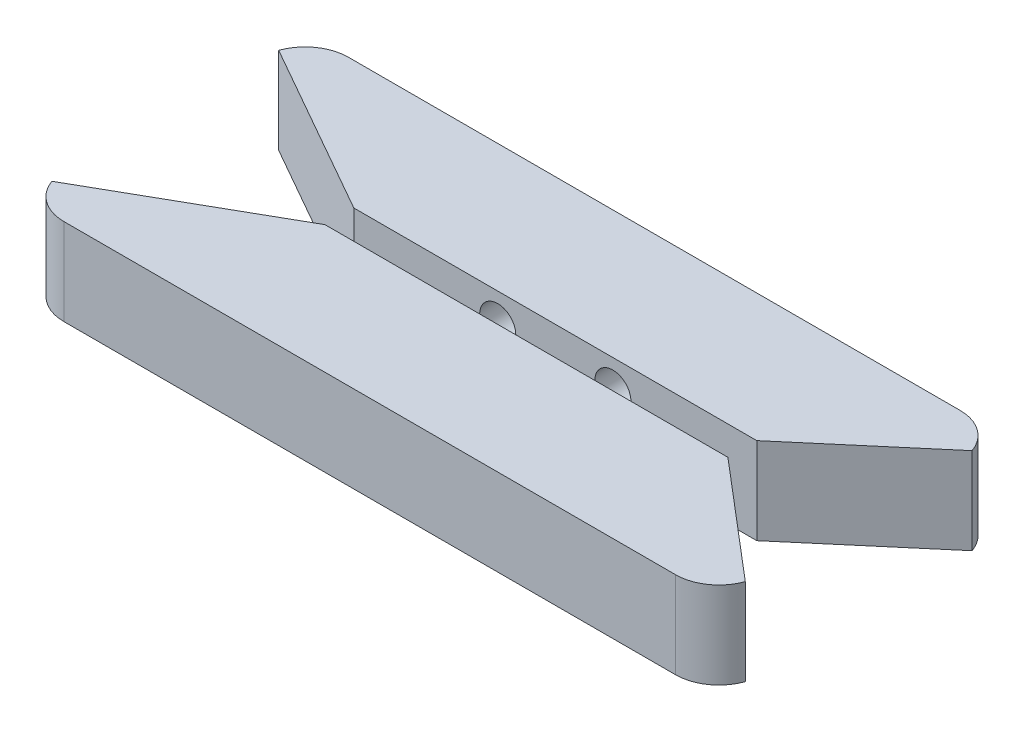
ISO-10303-21;
HEADER;
FILE_DESCRIPTION(('STEP AP214'),'2;1');
FILE_NAME('part.step','',(''),(''),'','','');
FILE_SCHEMA(('AUTOMOTIVE_DESIGN { 1 0 10303 214 1 1 1 1 }'));
ENDSEC;
DATA;
#1=APPLICATION_CONTEXT('core data for automotive mechanical design processes');
#2=APPLICATION_PROTOCOL_DEFINITION('international standard','automotive_design',2000,#1);
#3=PRODUCT_CONTEXT('',#1,'mechanical');
#4=PRODUCT('Part','Part','',(#3));
#5=PRODUCT_RELATED_PRODUCT_CATEGORY('part','',(#4));
#6=PRODUCT_DEFINITION_FORMATION('','',#4);
#7=PRODUCT_DEFINITION_CONTEXT('part definition',#1,'design');
#8=PRODUCT_DEFINITION('design','',#6,#7);
#9=PRODUCT_DEFINITION_SHAPE('','',#8);
#10=(LENGTH_UNIT() NAMED_UNIT(*) SI_UNIT(.MILLI.,.METRE.));
#11=(NAMED_UNIT(*) PLANE_ANGLE_UNIT() SI_UNIT($,.RADIAN.));
#12=(NAMED_UNIT(*) SI_UNIT($,.STERADIAN.) SOLID_ANGLE_UNIT());
#13=UNCERTAINTY_MEASURE_WITH_UNIT(LENGTH_MEASURE(1.E-05),#10,'distance_accuracy_value','');
#14=(GEOMETRIC_REPRESENTATION_CONTEXT(3) GLOBAL_UNCERTAINTY_ASSIGNED_CONTEXT((#13)) GLOBAL_UNIT_ASSIGNED_CONTEXT((#10,
#11,#12)) REPRESENTATION_CONTEXT('',''));
#15=CARTESIAN_POINT('',(0.,0.,0.));
#16=DIRECTION('',(0.,0.,1.));
#17=DIRECTION('',(1.,0.,0.));
#18=AXIS2_PLACEMENT_3D('',#15,#16,#17);
#19=CARTESIAN_POINT('',(-51.995,12.,17.7));
#20=DIRECTION('',(0.494195323295039,0.,0.869350897183244));
#21=DIRECTION('',(-0.869350897183244,0.,0.494195323295039));
#22=AXIS2_PLACEMENT_3D('',#19,#20,#21);
#23=PLANE('',#22);
#24=DIRECTION('',(0.869350897183244,0.,-0.494195323295039));
#25=VECTOR('',#24,1.);
#26=CARTESIAN_POINT('',(-51.995,0.,17.7));
#27=LINE('',#26,#25);
#28=CARTESIAN_POINT('',(-51.995,0.,17.7));
#29=VERTEX_POINT('',#28);
#30=CARTESIAN_POINT('',(-27.895,0.,4.));
#31=VERTEX_POINT('',#30);
#32=EDGE_CURVE('E112',#29,#31,#27,.T.);
#33=ORIENTED_EDGE('',*,*,#32,.F.);
#34=DIRECTION('',(0.,-1.,0.));
#35=VECTOR('',#34,1.);
#36=CARTESIAN_POINT('',(-51.995,12.,17.7));
#37=LINE('',#36,#35);
#38=CARTESIAN_POINT('',(-51.995,12.,17.7));
#39=VERTEX_POINT('',#38);
#40=EDGE_CURVE('E95',#39,#29,#37,.T.);
#41=ORIENTED_EDGE('',*,*,#40,.F.);
#42=DIRECTION('',(0.869350897183244,0.,-0.494195323295039));
#43=VECTOR('',#42,1.);
#44=CARTESIAN_POINT('',(-51.995,12.,17.7));
#45=LINE('',#44,#43);
#46=CARTESIAN_POINT('',(-27.895,12.,4.));
#47=VERTEX_POINT('',#46);
#48=EDGE_CURVE('E102',#39,#47,#45,.T.);
#49=ORIENTED_EDGE('',*,*,#48,.T.);
#50=DIRECTION('',(0.,-1.,0.));
#51=VECTOR('',#50,1.);
#52=CARTESIAN_POINT('',(-27.895,12.,4.));
#53=LINE('',#52,#51);
#54=EDGE_CURVE('E113',#47,#31,#53,.T.);
#55=ORIENTED_EDGE('',*,*,#54,.T.);
#56=EDGE_LOOP('',(#33,#41,#49,#55));
#57=FACE_BOUND('',#56,.T.);
#58=ADVANCED_FACE('F43',(#57),#23,.F.);
#59=CARTESIAN_POINT('',(-27.895,12.,4.));
#60=DIRECTION('',(0.,0.,1.));
#61=DIRECTION('',(-1.,0.,0.));
#62=AXIS2_PLACEMENT_3D('',#59,#60,#61);
#63=PLANE('',#62);
#64=CARTESIAN_POINT('',(-7.97,7.99999999999999,4.));
#65=DIRECTION('',(0.,0.,1.));
#66=DIRECTION('',(1.,0.,0.));
#67=AXIS2_PLACEMENT_3D('',#64,#65,#66);
#68=CIRCLE('',#67,2.5);
#69=CARTESIAN_POINT('',(-5.47,7.99999999999999,4.));
#70=VERTEX_POINT('',#69);
#71=EDGE_CURVE('E155',#70,#70,#68,.T.);
#72=ORIENTED_EDGE('',*,*,#71,.T.);
#73=EDGE_LOOP('',(#72));
#74=FACE_BOUND('',#73,.T.);
#75=CARTESIAN_POINT('',(7.97,7.99999999999999,4.));
#76=DIRECTION('',(0.,0.,1.));
#77=DIRECTION('',(-1.,0.,0.));
#78=AXIS2_PLACEMENT_3D('',#75,#76,#77);
#79=CIRCLE('',#78,2.5);
#80=CARTESIAN_POINT('',(5.47,7.99999999999999,4.));
#81=VERTEX_POINT('',#80);
#82=EDGE_CURVE('E164',#81,#81,#79,.T.);
#83=ORIENTED_EDGE('',*,*,#82,.T.);
#84=EDGE_LOOP('',(#83));
#85=FACE_BOUND('',#84,.T.);
#86=DIRECTION('',(1.,0.,0.));
#87=VECTOR('',#86,1.);
#88=CARTESIAN_POINT('',(-27.895,0.,4.));
#89=LINE('',#88,#87);
#90=CARTESIAN_POINT('',(27.895,0.,4.));
#91=VERTEX_POINT('',#90);
#92=EDGE_CURVE('E142',#31,#91,#89,.T.);
#93=ORIENTED_EDGE('',*,*,#92,.F.);
#94=ORIENTED_EDGE('',*,*,#54,.F.);
#95=DIRECTION('',(1.,0.,0.));
#96=VECTOR('',#95,1.);
#97=CARTESIAN_POINT('',(-27.895,12.,4.));
#98=LINE('',#97,#96);
#99=CARTESIAN_POINT('',(27.895,12.,4.));
#100=VERTEX_POINT('',#99);
#101=EDGE_CURVE('E105',#47,#100,#98,.T.);
#102=ORIENTED_EDGE('',*,*,#101,.T.);
#103=DIRECTION('',(0.,-1.,0.));
#104=VECTOR('',#103,1.);
#105=CARTESIAN_POINT('',(27.895,12.,4.));
#106=LINE('',#105,#104);
#107=EDGE_CURVE('E117',#100,#91,#106,.T.);
#108=ORIENTED_EDGE('',*,*,#107,.T.);
#109=EDGE_LOOP('',(#93,#94,#102,#108));
#110=FACE_BOUND('',#109,.T.);
#111=ADVANCED_FACE('F148',(#74,#85,#110),#63,.F.);
#112=CARTESIAN_POINT('',(27.895,12.,4.));
#113=DIRECTION('',(-0.647826842451469,0.,0.761787622765925));
#114=DIRECTION('',(-0.761787622765925,0.,-0.647826842451469));
#115=AXIS2_PLACEMENT_3D('',#112,#113,#114);
#116=PLANE('',#115);
#117=DIRECTION('',(0.761787622765925,0.,0.647826842451469));
#118=VECTOR('',#117,1.);
#119=CARTESIAN_POINT('',(27.895,0.,4.));
#120=LINE('',#119,#118);
#121=CARTESIAN_POINT('',(44.005,0.,17.7));
#122=VERTEX_POINT('',#121);
#123=EDGE_CURVE('E135',#91,#122,#120,.T.);
#124=ORIENTED_EDGE('',*,*,#123,.F.);
#125=ORIENTED_EDGE('',*,*,#107,.F.);
#126=DIRECTION('',(0.761787622765925,0.,0.647826842451469));
#127=VECTOR('',#126,1.);
#128=CARTESIAN_POINT('',(27.895,12.,4.));
#129=LINE('',#128,#127);
#130=CARTESIAN_POINT('',(44.005,12.,17.7));
#131=VERTEX_POINT('',#130);
#132=EDGE_CURVE('E137',#100,#131,#129,.T.);
#133=ORIENTED_EDGE('',*,*,#132,.T.);
#134=DIRECTION('',(0.,-1.,0.));
#135=VECTOR('',#134,1.);
#136=CARTESIAN_POINT('',(44.005,12.,17.7));
#137=LINE('',#136,#135);
#138=EDGE_CURVE('E126',#131,#122,#137,.T.);
#139=ORIENTED_EDGE('',*,*,#138,.T.);
#140=EDGE_LOOP('',(#124,#125,#133,#139));
#141=FACE_BOUND('',#140,.T.);
#142=ADVANCED_FACE('F133',(#141),#116,.F.);
#143=CARTESIAN_POINT('',(-51.995,12.,21.7));
#144=DIRECTION('',(0.,0.,-1.));
#145=DIRECTION('',(1.,0.,0.));
#146=AXIS2_PLACEMENT_3D('',#143,#144,#145);
#147=PLANE('',#146);
#148=DIRECTION('',(-1.,0.,0.));
#149=VECTOR('',#148,1.);
#150=CARTESIAN_POINT('',(-51.995,12.,21.7));
#151=LINE('',#150,#149);
#152=CARTESIAN_POINT('',(38.3481457505076,12.,21.7));
#153=VERTEX_POINT('',#152);
#154=CARTESIAN_POINT('',(-46.3381457505076,12.,21.7));
#155=VERTEX_POINT('',#154);
#156=EDGE_CURVE('E138',#153,#155,#151,.T.);
#157=ORIENTED_EDGE('',*,*,#156,.T.);
#158=DIRECTION('',(0.,1.,0.));
#159=VECTOR('',#158,1.);
#160=CARTESIAN_POINT('',(-46.3381457505076,12.,21.7));
#161=LINE('',#160,#159);
#162=CARTESIAN_POINT('',(-46.3381457505076,0.,21.7));
#163=VERTEX_POINT('',#162);
#164=EDGE_CURVE('E98',#163,#155,#161,.T.);
#165=ORIENTED_EDGE('',*,*,#164,.F.);
#166=DIRECTION('',(-1.,0.,0.));
#167=VECTOR('',#166,1.);
#168=CARTESIAN_POINT('',(-51.995,0.,21.7));
#169=LINE('',#168,#167);
#170=CARTESIAN_POINT('',(38.3481457505076,0.,21.7));
#171=VERTEX_POINT('',#170);
#172=EDGE_CURVE('E109',#171,#163,#169,.T.);
#173=ORIENTED_EDGE('',*,*,#172,.F.);
#174=DIRECTION('',(0.,-1.,0.));
#175=VECTOR('',#174,1.);
#176=CARTESIAN_POINT('',(38.3481457505076,12.,21.7));
#177=LINE('',#176,#175);
#178=EDGE_CURVE('E115',#153,#171,#177,.T.);
#179=ORIENTED_EDGE('',*,*,#178,.F.);
#180=EDGE_LOOP('',(#157,#165,#173,#179));
#181=FACE_BOUND('',#180,.T.);
#182=ADVANCED_FACE('F230',(#181),#147,.F.);
#183=CARTESIAN_POINT('',(0.,12.,4.));
#184=DIRECTION('',(0.,1.,0.));
#185=DIRECTION('',(0.,0.,-1.));
#186=AXIS2_PLACEMENT_3D('',#183,#184,#185);
#187=PLANE('',#186);
#188=ORIENTED_EDGE('',*,*,#132,.F.);
#189=ORIENTED_EDGE('',*,*,#101,.F.);
#190=ORIENTED_EDGE('',*,*,#48,.F.);
#191=CARTESIAN_POINT('',(-46.3381457505076,12.,15.7));
#192=DIRECTION('',(0.,-1.,0.));
#193=DIRECTION('',(0.,0.,-1.));
#194=AXIS2_PLACEMENT_3D('',#191,#192,#193);
#195=CIRCLE('',#194,6.);
#196=EDGE_CURVE('E51',#155,#39,#195,.T.);
#197=ORIENTED_EDGE('',*,*,#196,.F.);
#198=ORIENTED_EDGE('',*,*,#156,.F.);
#199=CARTESIAN_POINT('',(38.3481457505076,12.,15.7));
#200=DIRECTION('',(0.,-1.,0.));
#201=DIRECTION('',(0.,0.,-1.));
#202=AXIS2_PLACEMENT_3D('',#199,#200,#201);
#203=CIRCLE('',#202,6.);
#204=EDGE_CURVE('E12',#131,#153,#203,.T.);
#205=ORIENTED_EDGE('',*,*,#204,.F.);
#206=EDGE_LOOP('',(#188,#189,#190,#197,#198,#205));
#207=FACE_BOUND('',#206,.T.);
#208=ADVANCED_FACE('F103',(#207),#187,.T.);
#209=CARTESIAN_POINT('',(0.,0.,4.));
#210=DIRECTION('',(0.,1.,0.));
#211=DIRECTION('',(0.,0.,-1.));
#212=AXIS2_PLACEMENT_3D('',#209,#210,#211);
#213=PLANE('',#212);
#214=ORIENTED_EDGE('',*,*,#172,.T.);
#215=CARTESIAN_POINT('',(-46.3381457505076,0.,15.7));
#216=DIRECTION('',(0.,-1.,0.));
#217=DIRECTION('',(0.,0.,-1.));
#218=AXIS2_PLACEMENT_3D('',#215,#216,#217);
#219=CIRCLE('',#218,6.);
#220=EDGE_CURVE('E122',#29,#163,#219,.F.);
#221=ORIENTED_EDGE('',*,*,#220,.F.);
#222=ORIENTED_EDGE('',*,*,#32,.T.);
#223=ORIENTED_EDGE('',*,*,#92,.T.);
#224=ORIENTED_EDGE('',*,*,#123,.T.);
#225=CARTESIAN_POINT('',(38.3481457505076,0.,15.7));
#226=DIRECTION('',(0.,-1.,0.));
#227=DIRECTION('',(0.,0.,-1.));
#228=AXIS2_PLACEMENT_3D('',#225,#226,#227);
#229=CIRCLE('',#228,6.);
#230=EDGE_CURVE('E100',#171,#122,#229,.F.);
#231=ORIENTED_EDGE('',*,*,#230,.F.);
#232=EDGE_LOOP('',(#214,#221,#222,#223,#224,#231));
#233=FACE_BOUND('',#232,.T.);
#234=ADVANCED_FACE('F141',(#233),#213,.F.);
#235=CARTESIAN_POINT('',(7.97,7.99999999999999,12.5));
#236=DIRECTION('',(0.,0.,-1.));
#237=DIRECTION('',(1.,0.,0.));
#238=AXIS2_PLACEMENT_3D('',#235,#236,#237);
#239=CYLINDRICAL_SURFACE('',#238,2.5);
#240=CARTESIAN_POINT('',(7.97,7.99999999999999,12.5));
#241=DIRECTION('',(0.,0.,1.));
#242=DIRECTION('',(-1.,0.,0.));
#243=AXIS2_PLACEMENT_3D('',#240,#241,#242);
#244=CIRCLE('',#243,2.5);
#245=CARTESIAN_POINT('',(5.47,7.99999999999999,12.5));
#246=VERTEX_POINT('',#245);
#247=EDGE_CURVE('E160',#246,#246,#244,.T.);
#248=ORIENTED_EDGE('',*,*,#247,.T.);
#249=EDGE_LOOP('',(#248));
#250=FACE_BOUND('',#249,.T.);
#251=ORIENTED_EDGE('',*,*,#82,.F.);
#252=EDGE_LOOP('',(#251));
#253=FACE_BOUND('',#252,.T.);
#254=ADVANCED_FACE('F169',(#250,#253),#239,.F.);
#255=CARTESIAN_POINT('',(7.97,7.99999999999999,12.5));
#256=DIRECTION('',(0.,0.,1.));
#257=DIRECTION('',(-1.,0.,0.));
#258=AXIS2_PLACEMENT_3D('',#255,#256,#257);
#259=PLANE('',#258);
#260=ORIENTED_EDGE('',*,*,#247,.F.);
#261=EDGE_LOOP('',(#260));
#262=FACE_BOUND('',#261,.T.);
#263=ADVANCED_FACE('F171',(#262),#259,.F.);
#264=CARTESIAN_POINT('',(-7.97,7.99999999999999,12.5));
#265=DIRECTION('',(0.,0.,-1.));
#266=DIRECTION('',(1.,0.,0.));
#267=AXIS2_PLACEMENT_3D('',#264,#265,#266);
#268=CYLINDRICAL_SURFACE('',#267,2.5);
#269=CARTESIAN_POINT('',(-7.97,7.99999999999999,12.5));
#270=DIRECTION('',(0.,0.,1.));
#271=DIRECTION('',(1.,0.,0.));
#272=AXIS2_PLACEMENT_3D('',#269,#270,#271);
#273=CIRCLE('',#272,2.5);
#274=CARTESIAN_POINT('',(-5.47,7.99999999999999,12.5));
#275=VERTEX_POINT('',#274);
#276=EDGE_CURVE('E153',#275,#275,#273,.T.);
#277=ORIENTED_EDGE('',*,*,#276,.T.);
#278=EDGE_LOOP('',(#277));
#279=FACE_BOUND('',#278,.T.);
#280=ORIENTED_EDGE('',*,*,#71,.F.);
#281=EDGE_LOOP('',(#280));
#282=FACE_BOUND('',#281,.T.);
#283=ADVANCED_FACE('F178',(#279,#282),#268,.F.);
#284=CARTESIAN_POINT('',(-7.97,7.99999999999999,12.5));
#285=DIRECTION('',(0.,0.,-1.));
#286=DIRECTION('',(1.,0.,0.));
#287=AXIS2_PLACEMENT_3D('',#284,#285,#286);
#288=PLANE('',#287);
#289=ORIENTED_EDGE('',*,*,#276,.F.);
#290=EDGE_LOOP('',(#289));
#291=FACE_BOUND('',#290,.T.);
#292=ADVANCED_FACE('F192',(#291),#288,.T.);
#293=CARTESIAN_POINT('',(38.3481457505076,12.,15.7));
#294=DIRECTION('',(0.,-1.,0.));
#295=DIRECTION('',(0.,0.,1.));
#296=AXIS2_PLACEMENT_3D('',#293,#294,#295);
#297=CYLINDRICAL_SURFACE('',#296,6.);
#298=ORIENTED_EDGE('',*,*,#204,.T.);
#299=ORIENTED_EDGE('',*,*,#178,.T.);
#300=ORIENTED_EDGE('',*,*,#230,.T.);
#301=ORIENTED_EDGE('',*,*,#138,.F.);
#302=EDGE_LOOP('',(#298,#299,#300,#301));
#303=FACE_BOUND('',#302,.T.);
#304=ADVANCED_FACE('F125',(#303),#297,.T.);
#305=CARTESIAN_POINT('',(-46.3381457505076,12.,15.7));
#306=DIRECTION('',(0.,1.,0.));
#307=DIRECTION('',(0.,0.,-1.));
#308=AXIS2_PLACEMENT_3D('',#305,#306,#307);
#309=CYLINDRICAL_SURFACE('',#308,6.);
#310=ORIENTED_EDGE('',*,*,#196,.T.);
#311=ORIENTED_EDGE('',*,*,#40,.T.);
#312=ORIENTED_EDGE('',*,*,#220,.T.);
#313=ORIENTED_EDGE('',*,*,#164,.T.);
#314=EDGE_LOOP('',(#310,#311,#312,#313));
#315=FACE_BOUND('',#314,.T.);
#316=ADVANCED_FACE('F45',(#315),#309,.T.);
#317=CLOSED_SHELL('',(#58,#111,#142,#182,#208,#234,#254,#263,#283,#292,#304,#316));
#318=MANIFOLD_SOLID_BREP('B2',#317);
#319=CARTESIAN_POINT('',(-51.995,12.,-13.7));
#320=DIRECTION('',(0.494195323295039,0.,-0.869350897183244));
#321=DIRECTION('',(-0.869350897183244,0.,-0.494195323295039));
#322=AXIS2_PLACEMENT_3D('',#319,#320,#321);
#323=PLANE('',#322);
#324=DIRECTION('',(0.869350897183244,0.,0.494195323295039));
#325=VECTOR('',#324,1.);
#326=CARTESIAN_POINT('',(-51.995,0.,-13.7));
#327=LINE('',#326,#325);
#328=CARTESIAN_POINT('',(-51.995,0.,-13.7));
#329=VERTEX_POINT('',#328);
#330=CARTESIAN_POINT('',(-27.895,0.,0.));
#331=VERTEX_POINT('',#330);
#332=EDGE_CURVE('E384',#329,#331,#327,.T.);
#333=ORIENTED_EDGE('',*,*,#332,.T.);
#334=DIRECTION('',(0.,-1.,0.));
#335=VECTOR('',#334,1.);
#336=CARTESIAN_POINT('',(-27.895,12.,0.));
#337=LINE('',#336,#335);
#338=CARTESIAN_POINT('',(-27.895,12.,0.));
#339=VERTEX_POINT('',#338);
#340=EDGE_CURVE('E341',#339,#331,#337,.T.);
#341=ORIENTED_EDGE('',*,*,#340,.F.);
#342=DIRECTION('',(0.869350897183244,0.,0.494195323295039));
#343=VECTOR('',#342,1.);
#344=CARTESIAN_POINT('',(-51.995,12.,-13.7));
#345=LINE('',#344,#343);
#346=CARTESIAN_POINT('',(-51.995,12.,-13.7));
#347=VERTEX_POINT('',#346);
#348=EDGE_CURVE('E331',#347,#339,#345,.T.);
#349=ORIENTED_EDGE('',*,*,#348,.F.);
#350=DIRECTION('',(0.,-1.,0.));
#351=VECTOR('',#350,1.);
#352=CARTESIAN_POINT('',(-51.995,12.,-13.7));
#353=LINE('',#352,#351);
#354=EDGE_CURVE('E339',#347,#329,#353,.T.);
#355=ORIENTED_EDGE('',*,*,#354,.T.);
#356=EDGE_LOOP('',(#333,#341,#349,#355));
#357=FACE_BOUND('',#356,.T.);
#358=ADVANCED_FACE('F279',(#357),#323,.F.);
#359=CARTESIAN_POINT('',(-27.895,12.,0.));
#360=DIRECTION('',(0.,0.,-1.));
#361=DIRECTION('',(-1.,0.,0.));
#362=AXIS2_PLACEMENT_3D('',#359,#360,#361);
#363=PLANE('',#362);
#364=CARTESIAN_POINT('',(-7.97,7.99999999999999,0.));
#365=DIRECTION('',(0.,0.,1.));
#366=DIRECTION('',(1.,0.,0.));
#367=AXIS2_PLACEMENT_3D('',#364,#365,#366);
#368=CIRCLE('',#367,2.5);
#369=CARTESIAN_POINT('',(-5.47,7.99999999999999,0.));
#370=VERTEX_POINT('',#369);
#371=EDGE_CURVE('E395',#370,#370,#368,.T.);
#372=ORIENTED_EDGE('',*,*,#371,.F.);
#373=EDGE_LOOP('',(#372));
#374=FACE_BOUND('',#373,.T.);
#375=CARTESIAN_POINT('',(7.97,7.99999999999999,0.));
#376=DIRECTION('',(0.,0.,1.));
#377=DIRECTION('',(-1.,0.,0.));
#378=AXIS2_PLACEMENT_3D('',#375,#376,#377);
#379=CIRCLE('',#378,2.5);
#380=CARTESIAN_POINT('',(5.47,7.99999999999999,0.));
#381=VERTEX_POINT('',#380);
#382=EDGE_CURVE('E389',#381,#381,#379,.T.);
#383=ORIENTED_EDGE('',*,*,#382,.F.);
#384=EDGE_LOOP('',(#383));
#385=FACE_BOUND('',#384,.T.);
#386=DIRECTION('',(1.,0.,0.));
#387=VECTOR('',#386,1.);
#388=CARTESIAN_POINT('',(-27.895,0.,0.));
#389=LINE('',#388,#387);
#390=CARTESIAN_POINT('',(27.895,0.,0.));
#391=VERTEX_POINT('',#390);
#392=EDGE_CURVE('E375',#331,#391,#389,.T.);
#393=ORIENTED_EDGE('',*,*,#392,.T.);
#394=DIRECTION('',(0.,-1.,0.));
#395=VECTOR('',#394,1.);
#396=CARTESIAN_POINT('',(27.895,12.,0.));
#397=LINE('',#396,#395);
#398=CARTESIAN_POINT('',(27.895,12.,0.));
#399=VERTEX_POINT('',#398);
#400=EDGE_CURVE('E351',#399,#391,#397,.T.);
#401=ORIENTED_EDGE('',*,*,#400,.F.);
#402=DIRECTION('',(1.,0.,0.));
#403=VECTOR('',#402,1.);
#404=CARTESIAN_POINT('',(-27.895,12.,0.));
#405=LINE('',#404,#403);
#406=EDGE_CURVE('E343',#339,#399,#405,.T.);
#407=ORIENTED_EDGE('',*,*,#406,.F.);
#408=ORIENTED_EDGE('',*,*,#340,.T.);
#409=EDGE_LOOP('',(#393,#401,#407,#408));
#410=FACE_BOUND('',#409,.T.);
#411=ADVANCED_FACE('F410',(#374,#385,#410),#363,.F.);
#412=CARTESIAN_POINT('',(27.895,12.,0.));
#413=DIRECTION('',(-0.647826842451469,0.,-0.761787622765925));
#414=DIRECTION('',(-0.761787622765925,0.,0.647826842451469));
#415=AXIS2_PLACEMENT_3D('',#412,#413,#414);
#416=PLANE('',#415);
#417=DIRECTION('',(0.761787622765925,0.,-0.647826842451469));
#418=VECTOR('',#417,1.);
#419=CARTESIAN_POINT('',(27.895,0.,0.));
#420=LINE('',#419,#418);
#421=CARTESIAN_POINT('',(44.005,0.,-13.7));
#422=VERTEX_POINT('',#421);
#423=EDGE_CURVE('E364',#391,#422,#420,.T.);
#424=ORIENTED_EDGE('',*,*,#423,.T.);
#425=DIRECTION('',(0.,-1.,0.));
#426=VECTOR('',#425,1.);
#427=CARTESIAN_POINT('',(44.005,12.,-13.7));
#428=LINE('',#427,#426);
#429=CARTESIAN_POINT('',(44.005,12.,-13.7));
#430=VERTEX_POINT('',#429);
#431=EDGE_CURVE('E373',#430,#422,#428,.T.);
#432=ORIENTED_EDGE('',*,*,#431,.F.);
#433=DIRECTION('',(0.761787622765925,0.,-0.647826842451469));
#434=VECTOR('',#433,1.);
#435=CARTESIAN_POINT('',(27.895,12.,0.));
#436=LINE('',#435,#434);
#437=EDGE_CURVE('E379',#399,#430,#436,.T.);
#438=ORIENTED_EDGE('',*,*,#437,.F.);
#439=ORIENTED_EDGE('',*,*,#400,.T.);
#440=EDGE_LOOP('',(#424,#432,#438,#439));
#441=FACE_BOUND('',#440,.T.);
#442=ADVANCED_FACE('F371',(#441),#416,.F.);
#443=CARTESIAN_POINT('',(-51.995,12.,-17.7));
#444=DIRECTION('',(0.,0.,1.));
#445=DIRECTION('',(1.,0.,0.));
#446=AXIS2_PLACEMENT_3D('',#443,#444,#445);
#447=PLANE('',#446);
#448=DIRECTION('',(-1.,0.,0.));
#449=VECTOR('',#448,1.);
#450=CARTESIAN_POINT('',(-51.995,12.,-17.7));
#451=LINE('',#450,#449);
#452=CARTESIAN_POINT('',(38.3481457505076,12.,-17.7));
#453=VERTEX_POINT('',#452);
#454=CARTESIAN_POINT('',(-46.3381457505076,12.,-17.7));
#455=VERTEX_POINT('',#454);
#456=EDGE_CURVE('E333',#453,#455,#451,.T.);
#457=ORIENTED_EDGE('',*,*,#456,.F.);
#458=DIRECTION('',(0.,-1.,0.));
#459=VECTOR('',#458,1.);
#460=CARTESIAN_POINT('',(38.3481457505076,12.,-17.7));
#461=LINE('',#460,#459);
#462=CARTESIAN_POINT('',(38.3481457505076,0.,-17.7));
#463=VERTEX_POINT('',#462);
#464=EDGE_CURVE('E349',#453,#463,#461,.T.);
#465=ORIENTED_EDGE('',*,*,#464,.T.);
#466=DIRECTION('',(-1.,0.,0.));
#467=VECTOR('',#466,1.);
#468=CARTESIAN_POINT('',(-51.995,0.,-17.7));
#469=LINE('',#468,#467);
#470=CARTESIAN_POINT('',(-46.3381457505076,0.,-17.7));
#471=VERTEX_POINT('',#470);
#472=EDGE_CURVE('E344',#463,#471,#469,.T.);
#473=ORIENTED_EDGE('',*,*,#472,.T.);
#474=DIRECTION('',(0.,1.,0.));
#475=VECTOR('',#474,1.);
#476=CARTESIAN_POINT('',(-46.3381457505076,12.,-17.7));
#477=LINE('',#476,#475);
#478=EDGE_CURVE('E294',#471,#455,#477,.T.);
#479=ORIENTED_EDGE('',*,*,#478,.T.);
#480=EDGE_LOOP('',(#457,#465,#473,#479));
#481=FACE_BOUND('',#480,.T.);
#482=ADVANCED_FACE('F416',(#481),#447,.F.);
#483=CARTESIAN_POINT('',(0.,12.,0.));
#484=DIRECTION('',(0.,1.,0.));
#485=DIRECTION('',(0.,0.,1.));
#486=AXIS2_PLACEMENT_3D('',#483,#484,#485);
#487=PLANE('',#486);
#488=ORIENTED_EDGE('',*,*,#437,.T.);
#489=CARTESIAN_POINT('',(38.3481457505076,12.,-11.7));
#490=DIRECTION('',(0.,1.,0.));
#491=DIRECTION('',(0.,0.,1.));
#492=AXIS2_PLACEMENT_3D('',#489,#490,#491);
#493=CIRCLE('',#492,6.);
#494=EDGE_CURVE('E41',#430,#453,#493,.T.);
#495=ORIENTED_EDGE('',*,*,#494,.T.);
#496=ORIENTED_EDGE('',*,*,#456,.T.);
#497=CARTESIAN_POINT('',(-46.3381457505076,12.,-11.7));
#498=DIRECTION('',(0.,1.,0.));
#499=DIRECTION('',(0.,0.,1.));
#500=AXIS2_PLACEMENT_3D('',#497,#498,#499);
#501=CIRCLE('',#500,6.);
#502=EDGE_CURVE('E287',#455,#347,#501,.T.);
#503=ORIENTED_EDGE('',*,*,#502,.T.);
#504=ORIENTED_EDGE('',*,*,#348,.T.);
#505=ORIENTED_EDGE('',*,*,#406,.T.);
#506=EDGE_LOOP('',(#488,#495,#496,#503,#504,#505));
#507=FACE_BOUND('',#506,.T.);
#508=ADVANCED_FACE('F330',(#507),#487,.T.);
#509=CARTESIAN_POINT('',(0.,0.,0.));
#510=DIRECTION('',(0.,1.,0.));
#511=DIRECTION('',(0.,0.,1.));
#512=AXIS2_PLACEMENT_3D('',#509,#510,#511);
#513=PLANE('',#512);
#514=ORIENTED_EDGE('',*,*,#472,.F.);
#515=CARTESIAN_POINT('',(38.3481457505076,0.,-11.7));
#516=DIRECTION('',(0.,1.,0.));
#517=DIRECTION('',(0.,0.,1.));
#518=AXIS2_PLACEMENT_3D('',#515,#516,#517);
#519=CIRCLE('',#518,6.);
#520=EDGE_CURVE('E336',#463,#422,#519,.F.);
#521=ORIENTED_EDGE('',*,*,#520,.T.);
#522=ORIENTED_EDGE('',*,*,#423,.F.);
#523=ORIENTED_EDGE('',*,*,#392,.F.);
#524=ORIENTED_EDGE('',*,*,#332,.F.);
#525=CARTESIAN_POINT('',(-46.3381457505076,0.,-11.7));
#526=DIRECTION('',(0.,1.,0.));
#527=DIRECTION('',(0.,0.,1.));
#528=AXIS2_PLACEMENT_3D('',#525,#526,#527);
#529=CIRCLE('',#528,6.);
#530=EDGE_CURVE('E346',#329,#471,#529,.F.);
#531=ORIENTED_EDGE('',*,*,#530,.T.);
#532=EDGE_LOOP('',(#514,#521,#522,#523,#524,#531));
#533=FACE_BOUND('',#532,.T.);
#534=ADVANCED_FACE('F362',(#533),#513,.F.);
#535=CARTESIAN_POINT('',(7.97,7.99999999999999,-8.5));
#536=DIRECTION('',(0.,0.,1.));
#537=DIRECTION('',(1.,0.,0.));
#538=AXIS2_PLACEMENT_3D('',#535,#536,#537);
#539=CYLINDRICAL_SURFACE('',#538,2.5);
#540=CARTESIAN_POINT('',(7.97,7.99999999999999,-8.5));
#541=DIRECTION('',(0.,0.,1.));
#542=DIRECTION('',(-1.,0.,0.));
#543=AXIS2_PLACEMENT_3D('',#540,#541,#542);
#544=CIRCLE('',#543,2.5);
#545=CARTESIAN_POINT('',(5.47,7.99999999999999,-8.5));
#546=VERTEX_POINT('',#545);
#547=EDGE_CURVE('E392',#546,#546,#544,.T.);
#548=ORIENTED_EDGE('',*,*,#547,.F.);
#549=EDGE_LOOP('',(#548));
#550=FACE_BOUND('',#549,.T.);
#551=ORIENTED_EDGE('',*,*,#382,.T.);
#552=EDGE_LOOP('',(#551));
#553=FACE_BOUND('',#552,.T.);
#554=ADVANCED_FACE('F441',(#550,#553),#539,.F.);
#555=CARTESIAN_POINT('',(7.97,7.99999999999999,-8.5));
#556=DIRECTION('',(0.,0.,-1.));
#557=DIRECTION('',(-1.,0.,0.));
#558=AXIS2_PLACEMENT_3D('',#555,#556,#557);
#559=PLANE('',#558);
#560=ORIENTED_EDGE('',*,*,#547,.T.);
#561=EDGE_LOOP('',(#560));
#562=FACE_BOUND('',#561,.T.);
#563=ADVANCED_FACE('F406',(#562),#559,.F.);
#564=CARTESIAN_POINT('',(-7.97,7.99999999999999,-8.5));
#565=DIRECTION('',(0.,0.,1.));
#566=DIRECTION('',(1.,0.,0.));
#567=AXIS2_PLACEMENT_3D('',#564,#565,#566);
#568=CYLINDRICAL_SURFACE('',#567,2.5);
#569=CARTESIAN_POINT('',(-7.97,7.99999999999999,-8.5));
#570=DIRECTION('',(0.,0.,1.));
#571=DIRECTION('',(1.,0.,0.));
#572=AXIS2_PLACEMENT_3D('',#569,#570,#571);
#573=CIRCLE('',#572,2.5);
#574=CARTESIAN_POINT('',(-5.47,7.99999999999999,-8.5));
#575=VERTEX_POINT('',#574);
#576=EDGE_CURVE('E385',#575,#575,#573,.T.);
#577=ORIENTED_EDGE('',*,*,#576,.F.);
#578=EDGE_LOOP('',(#577));
#579=FACE_BOUND('',#578,.T.);
#580=ORIENTED_EDGE('',*,*,#371,.T.);
#581=EDGE_LOOP('',(#580));
#582=FACE_BOUND('',#581,.T.);
#583=ADVANCED_FACE('F403',(#579,#582),#568,.F.);
#584=CARTESIAN_POINT('',(-7.97,7.99999999999999,-8.5));
#585=DIRECTION('',(0.,0.,1.));
#586=DIRECTION('',(1.,0.,0.));
#587=AXIS2_PLACEMENT_3D('',#584,#585,#586);
#588=PLANE('',#587);
#589=ORIENTED_EDGE('',*,*,#576,.T.);
#590=EDGE_LOOP('',(#589));
#591=FACE_BOUND('',#590,.T.);
#592=ADVANCED_FACE('F401',(#591),#588,.T.);
#593=CARTESIAN_POINT('',(38.3481457505076,12.,-11.7));
#594=DIRECTION('',(0.,-1.,0.));
#595=DIRECTION('',(0.,0.,-1.));
#596=AXIS2_PLACEMENT_3D('',#593,#594,#595);
#597=CYLINDRICAL_SURFACE('',#596,6.);
#598=ORIENTED_EDGE('',*,*,#494,.F.);
#599=ORIENTED_EDGE('',*,*,#431,.T.);
#600=ORIENTED_EDGE('',*,*,#520,.F.);
#601=ORIENTED_EDGE('',*,*,#464,.F.);
#602=EDGE_LOOP('',(#598,#599,#600,#601));
#603=FACE_BOUND('',#602,.T.);
#604=ADVANCED_FACE('F377',(#603),#597,.T.);
#605=CARTESIAN_POINT('',(-46.3381457505076,12.,-11.7));
#606=DIRECTION('',(0.,1.,0.));
#607=DIRECTION('',(0.,0.,1.));
#608=AXIS2_PLACEMENT_3D('',#605,#606,#607);
#609=CYLINDRICAL_SURFACE('',#608,6.);
#610=ORIENTED_EDGE('',*,*,#502,.F.);
#611=ORIENTED_EDGE('',*,*,#478,.F.);
#612=ORIENTED_EDGE('',*,*,#530,.F.);
#613=ORIENTED_EDGE('',*,*,#354,.F.);
#614=EDGE_LOOP('',(#610,#611,#612,#613));
#615=FACE_BOUND('',#614,.T.);
#616=ADVANCED_FACE('F281',(#615),#609,.T.);
#617=CLOSED_SHELL('',(#358,#411,#442,#482,#508,#534,#554,#563,#583,#592,#604,#616));
#618=MANIFOLD_SOLID_BREP('B6',#617);
#619=ADVANCED_BREP_SHAPE_REPRESENTATION('',(#18,#318,#618),#14);
#620=SHAPE_DEFINITION_REPRESENTATION(#9,#619);
ENDSEC;
END-ISO-10303-21;
